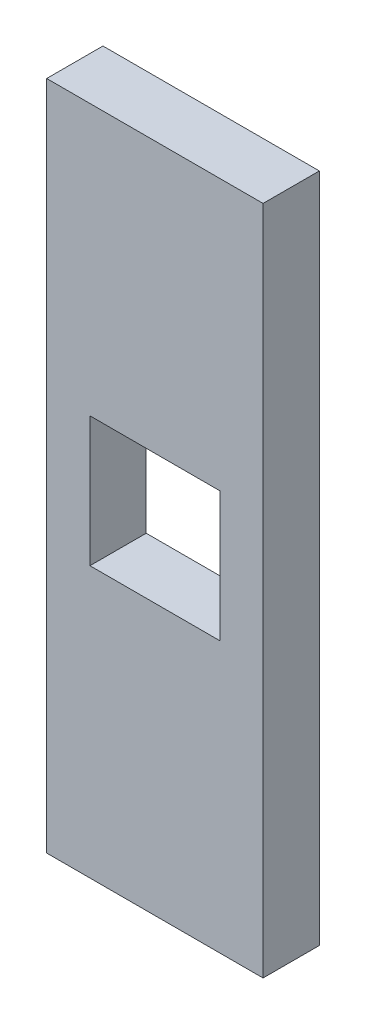
ISO-10303-21;
HEADER;
FILE_DESCRIPTION(('STEP AP214'),'2;1');
FILE_NAME('part.step','',(''),(''),'','','');
FILE_SCHEMA(('AUTOMOTIVE_DESIGN { 1 0 10303 214 1 1 1 1 }'));
ENDSEC;
DATA;
#1=APPLICATION_CONTEXT('core data for automotive mechanical design processes');
#2=APPLICATION_PROTOCOL_DEFINITION('international standard','automotive_design',2000,#1);
#3=PRODUCT_CONTEXT('',#1,'mechanical');
#4=PRODUCT('Part','Part','',(#3));
#5=PRODUCT_RELATED_PRODUCT_CATEGORY('part','',(#4));
#6=PRODUCT_DEFINITION_FORMATION('','',#4);
#7=PRODUCT_DEFINITION_CONTEXT('part definition',#1,'design');
#8=PRODUCT_DEFINITION('design','',#6,#7);
#9=PRODUCT_DEFINITION_SHAPE('','',#8);
#10=(LENGTH_UNIT() NAMED_UNIT(*) SI_UNIT(.MILLI.,.METRE.));
#11=(NAMED_UNIT(*) PLANE_ANGLE_UNIT() SI_UNIT($,.RADIAN.));
#12=(NAMED_UNIT(*) SI_UNIT($,.STERADIAN.) SOLID_ANGLE_UNIT());
#13=UNCERTAINTY_MEASURE_WITH_UNIT(LENGTH_MEASURE(1.E-05),#10,'distance_accuracy_value','');
#14=(GEOMETRIC_REPRESENTATION_CONTEXT(3) GLOBAL_UNCERTAINTY_ASSIGNED_CONTEXT((#13)) GLOBAL_UNIT_ASSIGNED_CONTEXT((#10,
#11,#12)) REPRESENTATION_CONTEXT('',''));
#15=CARTESIAN_POINT('',(0.,0.,0.));
#16=DIRECTION('',(0.,0.,1.));
#17=DIRECTION('',(1.,0.,0.));
#18=AXIS2_PLACEMENT_3D('',#15,#16,#17);
#19=CARTESIAN_POINT('',(0.,0.,5.2));
#20=DIRECTION('',(0.,0.,-1.));
#21=DIRECTION('',(-1.,0.,0.));
#22=AXIS2_PLACEMENT_3D('',#19,#20,#21);
#23=PLANE('',#22);
#24=DIRECTION('',(0.,-1.,0.));
#25=VECTOR('',#24,1.);
#26=CARTESIAN_POINT('',(0.,20.,5.2));
#27=LINE('',#26,#25);
#28=CARTESIAN_POINT('',(0.,62.,5.2));
#29=VERTEX_POINT('',#28);
#30=CARTESIAN_POINT('',(0.,0.,5.2));
#31=VERTEX_POINT('',#30);
#32=EDGE_CURVE('E134',#29,#31,#27,.T.);
#33=ORIENTED_EDGE('',*,*,#32,.T.);
#34=DIRECTION('',(1.,0.,0.));
#35=VECTOR('',#34,1.);
#36=CARTESIAN_POINT('',(20.,0.,5.2));
#37=LINE('',#36,#35);
#38=CARTESIAN_POINT('',(20.,0.,5.2));
#39=VERTEX_POINT('',#38);
#40=EDGE_CURVE('E137',#31,#39,#37,.T.);
#41=ORIENTED_EDGE('',*,*,#40,.T.);
#42=DIRECTION('',(0.,1.,0.));
#43=VECTOR('',#42,1.);
#44=CARTESIAN_POINT('',(20.,20.,5.2));
#45=LINE('',#44,#43);
#46=CARTESIAN_POINT('',(20.,62.,5.2));
#47=VERTEX_POINT('',#46);
#48=EDGE_CURVE('E140',#39,#47,#45,.T.);
#49=ORIENTED_EDGE('',*,*,#48,.T.);
#50=DIRECTION('',(-1.,0.,0.));
#51=VECTOR('',#50,1.);
#52=CARTESIAN_POINT('',(0.,62.,5.2));
#53=LINE('',#52,#51);
#54=EDGE_CURVE('E142',#47,#29,#53,.T.);
#55=ORIENTED_EDGE('',*,*,#54,.T.);
#56=EDGE_LOOP('',(#33,#41,#49,#55));
#57=FACE_BOUND('',#56,.T.);
#58=DIRECTION('',(0.,-1.,0.));
#59=VECTOR('',#58,1.);
#60=CARTESIAN_POINT('',(4.,37.,5.2));
#61=LINE('',#60,#59);
#62=CARTESIAN_POINT('',(4.,37.,5.2));
#63=VERTEX_POINT('',#62);
#64=CARTESIAN_POINT('',(4.00000000000001,25.,5.2));
#65=VERTEX_POINT('',#64);
#66=EDGE_CURVE('E98',#63,#65,#61,.T.);
#67=ORIENTED_EDGE('',*,*,#66,.F.);
#68=DIRECTION('',(-1.,0.,0.));
#69=VECTOR('',#68,1.);
#70=CARTESIAN_POINT('',(4.,37.,5.2));
#71=LINE('',#70,#69);
#72=CARTESIAN_POINT('',(16.,37.,5.2));
#73=VERTEX_POINT('',#72);
#74=EDGE_CURVE('E120',#73,#63,#71,.T.);
#75=ORIENTED_EDGE('',*,*,#74,.F.);
#76=DIRECTION('',(0.,1.,0.));
#77=VECTOR('',#76,1.);
#78=CARTESIAN_POINT('',(16.,37.,5.2));
#79=LINE('',#78,#77);
#80=CARTESIAN_POINT('',(16.,25.,5.2));
#81=VERTEX_POINT('',#80);
#82=EDGE_CURVE('E118',#81,#73,#79,.T.);
#83=ORIENTED_EDGE('',*,*,#82,.F.);
#84=DIRECTION('',(1.,0.,0.));
#85=VECTOR('',#84,1.);
#86=CARTESIAN_POINT('',(4.00000000000001,25.,5.2));
#87=LINE('',#86,#85);
#88=EDGE_CURVE('E106',#65,#81,#87,.T.);
#89=ORIENTED_EDGE('',*,*,#88,.F.);
#90=EDGE_LOOP('',(#67,#75,#83,#89));
#91=FACE_BOUND('',#90,.T.);
#92=ADVANCED_FACE('F33',(#57,#91),#23,.F.);
#93=CARTESIAN_POINT('',(0.,0.,0.));
#94=DIRECTION('',(0.,0.,-1.));
#95=DIRECTION('',(-1.,0.,0.));
#96=AXIS2_PLACEMENT_3D('',#93,#94,#95);
#97=PLANE('',#96);
#98=DIRECTION('',(1.,0.,0.));
#99=VECTOR('',#98,1.);
#100=CARTESIAN_POINT('',(20.,0.,0.));
#101=LINE('',#100,#99);
#102=CARTESIAN_POINT('',(0.,0.,0.));
#103=VERTEX_POINT('',#102);
#104=CARTESIAN_POINT('',(20.,0.,0.));
#105=VERTEX_POINT('',#104);
#106=EDGE_CURVE('E114',#103,#105,#101,.T.);
#107=ORIENTED_EDGE('',*,*,#106,.F.);
#108=DIRECTION('',(0.,-1.,0.));
#109=VECTOR('',#108,1.);
#110=CARTESIAN_POINT('',(0.,25.,0.));
#111=LINE('',#110,#109);
#112=CARTESIAN_POINT('',(0.,62.,0.));
#113=VERTEX_POINT('',#112);
#114=EDGE_CURVE('E138',#113,#103,#111,.T.);
#115=ORIENTED_EDGE('',*,*,#114,.F.);
#116=DIRECTION('',(-1.,0.,0.));
#117=VECTOR('',#116,1.);
#118=CARTESIAN_POINT('',(0.,62.,0.));
#119=LINE('',#118,#117);
#120=CARTESIAN_POINT('',(20.,62.,0.));
#121=VERTEX_POINT('',#120);
#122=EDGE_CURVE('E150',#121,#113,#119,.T.);
#123=ORIENTED_EDGE('',*,*,#122,.F.);
#124=DIRECTION('',(0.,1.,0.));
#125=VECTOR('',#124,1.);
#126=CARTESIAN_POINT('',(20.,62.,0.));
#127=LINE('',#126,#125);
#128=EDGE_CURVE('E148',#105,#121,#127,.T.);
#129=ORIENTED_EDGE('',*,*,#128,.F.);
#130=EDGE_LOOP('',(#107,#115,#123,#129));
#131=FACE_BOUND('',#130,.T.);
#132=DIRECTION('',(-1.,0.,0.));
#133=VECTOR('',#132,1.);
#134=CARTESIAN_POINT('',(4.,37.,0.));
#135=LINE('',#134,#133);
#136=CARTESIAN_POINT('',(16.,37.,0.));
#137=VERTEX_POINT('',#136);
#138=CARTESIAN_POINT('',(4.,37.,0.));
#139=VERTEX_POINT('',#138);
#140=EDGE_CURVE('E107',#137,#139,#135,.T.);
#141=ORIENTED_EDGE('',*,*,#140,.T.);
#142=DIRECTION('',(0.,-1.,0.));
#143=VECTOR('',#142,1.);
#144=CARTESIAN_POINT('',(4.,37.,0.));
#145=LINE('',#144,#143);
#146=CARTESIAN_POINT('',(4.00000000000001,25.,0.));
#147=VERTEX_POINT('',#146);
#148=EDGE_CURVE('E56',#139,#147,#145,.T.);
#149=ORIENTED_EDGE('',*,*,#148,.T.);
#150=DIRECTION('',(1.,0.,0.));
#151=VECTOR('',#150,1.);
#152=CARTESIAN_POINT('',(4.00000000000001,25.,0.));
#153=LINE('',#152,#151);
#154=CARTESIAN_POINT('',(16.,25.,0.));
#155=VERTEX_POINT('',#154);
#156=EDGE_CURVE('E113',#147,#155,#153,.T.);
#157=ORIENTED_EDGE('',*,*,#156,.T.);
#158=DIRECTION('',(0.,1.,0.));
#159=VECTOR('',#158,1.);
#160=CARTESIAN_POINT('',(16.,37.,0.));
#161=LINE('',#160,#159);
#162=EDGE_CURVE('E126',#155,#137,#161,.T.);
#163=ORIENTED_EDGE('',*,*,#162,.T.);
#164=EDGE_LOOP('',(#141,#149,#157,#163));
#165=FACE_BOUND('',#164,.T.);
#166=ADVANCED_FACE('F168',(#131,#165),#97,.T.);
#167=CARTESIAN_POINT('',(20.,0.,5.2));
#168=DIRECTION('',(0.,1.,0.));
#169=DIRECTION('',(-1.,0.,0.));
#170=AXIS2_PLACEMENT_3D('',#167,#168,#169);
#171=PLANE('',#170);
#172=ORIENTED_EDGE('',*,*,#106,.T.);
#173=DIRECTION('',(0.,0.,-1.));
#174=VECTOR('',#173,1.);
#175=CARTESIAN_POINT('',(20.,0.,5.2));
#176=LINE('',#175,#174);
#177=EDGE_CURVE('E41',#39,#105,#176,.T.);
#178=ORIENTED_EDGE('',*,*,#177,.F.);
#179=ORIENTED_EDGE('',*,*,#40,.F.);
#180=DIRECTION('',(0.,0.,-1.));
#181=VECTOR('',#180,1.);
#182=CARTESIAN_POINT('',(0.,0.,5.2));
#183=LINE('',#182,#181);
#184=EDGE_CURVE('E11',#31,#103,#183,.T.);
#185=ORIENTED_EDGE('',*,*,#184,.T.);
#186=EDGE_LOOP('',(#172,#178,#179,#185));
#187=FACE_BOUND('',#186,.T.);
#188=ADVANCED_FACE('F35',(#187),#171,.F.);
#189=CARTESIAN_POINT('',(20.,62.,5.2));
#190=DIRECTION('',(-1.,0.,0.));
#191=DIRECTION('',(0.,-1.,0.));
#192=AXIS2_PLACEMENT_3D('',#189,#190,#191);
#193=PLANE('',#192);
#194=ORIENTED_EDGE('',*,*,#128,.T.);
#195=DIRECTION('',(0.,0.,-1.));
#196=VECTOR('',#195,1.);
#197=CARTESIAN_POINT('',(20.,62.,5.2));
#198=LINE('',#197,#196);
#199=EDGE_CURVE('E156',#47,#121,#198,.T.);
#200=ORIENTED_EDGE('',*,*,#199,.F.);
#201=ORIENTED_EDGE('',*,*,#48,.F.);
#202=ORIENTED_EDGE('',*,*,#177,.T.);
#203=EDGE_LOOP('',(#194,#200,#201,#202));
#204=FACE_BOUND('',#203,.T.);
#205=ADVANCED_FACE('F162',(#204),#193,.F.);
#206=CARTESIAN_POINT('',(0.,62.,5.2));
#207=DIRECTION('',(0.,-1.,0.));
#208=DIRECTION('',(0.,0.,-1.));
#209=AXIS2_PLACEMENT_3D('',#206,#207,#208);
#210=PLANE('',#209);
#211=ORIENTED_EDGE('',*,*,#122,.T.);
#212=DIRECTION('',(0.,0.,-1.));
#213=VECTOR('',#212,1.);
#214=CARTESIAN_POINT('',(0.,62.,5.2));
#215=LINE('',#214,#213);
#216=EDGE_CURVE('E145',#29,#113,#215,.T.);
#217=ORIENTED_EDGE('',*,*,#216,.F.);
#218=ORIENTED_EDGE('',*,*,#54,.F.);
#219=ORIENTED_EDGE('',*,*,#199,.T.);
#220=EDGE_LOOP('',(#211,#217,#218,#219));
#221=FACE_BOUND('',#220,.T.);
#222=ADVANCED_FACE('F173',(#221),#210,.F.);
#223=CARTESIAN_POINT('',(0.,25.,5.2));
#224=DIRECTION('',(1.,0.,0.));
#225=DIRECTION('',(0.,1.,0.));
#226=AXIS2_PLACEMENT_3D('',#223,#224,#225);
#227=PLANE('',#226);
#228=ORIENTED_EDGE('',*,*,#114,.T.);
#229=ORIENTED_EDGE('',*,*,#184,.F.);
#230=ORIENTED_EDGE('',*,*,#32,.F.);
#231=ORIENTED_EDGE('',*,*,#216,.T.);
#232=EDGE_LOOP('',(#228,#229,#230,#231));
#233=FACE_BOUND('',#232,.T.);
#234=ADVANCED_FACE('F176',(#233),#227,.F.);
#235=CARTESIAN_POINT('',(4.,37.,5.2));
#236=DIRECTION('',(1.,0.,0.));
#237=DIRECTION('',(0.,1.,0.));
#238=AXIS2_PLACEMENT_3D('',#235,#236,#237);
#239=PLANE('',#238);
#240=ORIENTED_EDGE('',*,*,#148,.F.);
#241=DIRECTION('',(0.,0.,-1.));
#242=VECTOR('',#241,1.);
#243=CARTESIAN_POINT('',(4.,37.,5.2));
#244=LINE('',#243,#242);
#245=EDGE_CURVE('E102',#63,#139,#244,.T.);
#246=ORIENTED_EDGE('',*,*,#245,.F.);
#247=ORIENTED_EDGE('',*,*,#66,.T.);
#248=DIRECTION('',(0.,0.,-1.));
#249=VECTOR('',#248,1.);
#250=CARTESIAN_POINT('',(4.00000000000001,25.,5.2));
#251=LINE('',#250,#249);
#252=EDGE_CURVE('E101',#65,#147,#251,.T.);
#253=ORIENTED_EDGE('',*,*,#252,.T.);
#254=EDGE_LOOP('',(#240,#246,#247,#253));
#255=FACE_BOUND('',#254,.T.);
#256=ADVANCED_FACE('F100',(#255),#239,.T.);
#257=CARTESIAN_POINT('',(4.00000000000001,25.,5.2));
#258=DIRECTION('',(0.,1.,0.));
#259=DIRECTION('',(-1.,0.,0.));
#260=AXIS2_PLACEMENT_3D('',#257,#258,#259);
#261=PLANE('',#260);
#262=ORIENTED_EDGE('',*,*,#156,.F.);
#263=ORIENTED_EDGE('',*,*,#252,.F.);
#264=ORIENTED_EDGE('',*,*,#88,.T.);
#265=DIRECTION('',(0.,0.,-1.));
#266=VECTOR('',#265,1.);
#267=CARTESIAN_POINT('',(16.,25.,5.2));
#268=LINE('',#267,#266);
#269=EDGE_CURVE('E115',#81,#155,#268,.T.);
#270=ORIENTED_EDGE('',*,*,#269,.T.);
#271=EDGE_LOOP('',(#262,#263,#264,#270));
#272=FACE_BOUND('',#271,.T.);
#273=ADVANCED_FACE('F110',(#272),#261,.T.);
#274=CARTESIAN_POINT('',(16.,37.,5.2));
#275=DIRECTION('',(-1.,0.,0.));
#276=DIRECTION('',(0.,-1.,0.));
#277=AXIS2_PLACEMENT_3D('',#274,#275,#276);
#278=PLANE('',#277);
#279=ORIENTED_EDGE('',*,*,#162,.F.);
#280=ORIENTED_EDGE('',*,*,#269,.F.);
#281=ORIENTED_EDGE('',*,*,#82,.T.);
#282=DIRECTION('',(0.,0.,-1.));
#283=VECTOR('',#282,1.);
#284=CARTESIAN_POINT('',(16.,37.,5.2));
#285=LINE('',#284,#283);
#286=EDGE_CURVE('E48',#73,#137,#285,.T.);
#287=ORIENTED_EDGE('',*,*,#286,.T.);
#288=EDGE_LOOP('',(#279,#280,#281,#287));
#289=FACE_BOUND('',#288,.T.);
#290=ADVANCED_FACE('F260',(#289),#278,.T.);
#291=CARTESIAN_POINT('',(4.,37.,5.2));
#292=DIRECTION('',(0.,-1.,0.));
#293=DIRECTION('',(0.,0.,-1.));
#294=AXIS2_PLACEMENT_3D('',#291,#292,#293);
#295=PLANE('',#294);
#296=ORIENTED_EDGE('',*,*,#140,.F.);
#297=ORIENTED_EDGE('',*,*,#286,.F.);
#298=ORIENTED_EDGE('',*,*,#74,.T.);
#299=ORIENTED_EDGE('',*,*,#245,.T.);
#300=EDGE_LOOP('',(#296,#297,#298,#299));
#301=FACE_BOUND('',#300,.T.);
#302=ADVANCED_FACE('F267',(#301),#295,.T.);
#303=CLOSED_SHELL('',(#92,#166,#188,#205,#222,#234,#256,#273,#290,#302));
#304=MANIFOLD_SOLID_BREP('B2',#303);
#305=ADVANCED_BREP_SHAPE_REPRESENTATION('',(#18,#304),#14);
#306=SHAPE_DEFINITION_REPRESENTATION(#9,#305);
ENDSEC;
END-ISO-10303-21;
